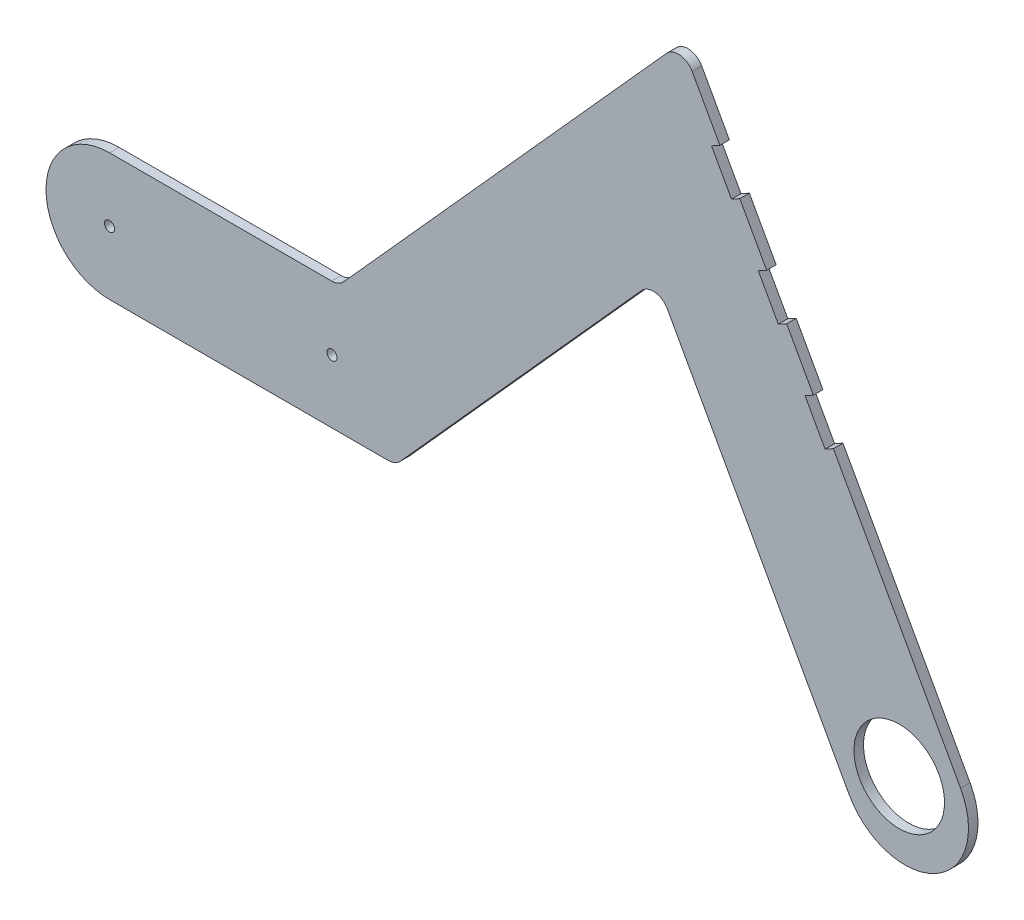
ISO-10303-21;
HEADER;
FILE_DESCRIPTION(('STEP AP214'),'2;1');
FILE_NAME('part.step','',(''),(''),'','','');
FILE_SCHEMA(('AUTOMOTIVE_DESIGN { 1 0 10303 214 1 1 1 1 }'));
ENDSEC;
DATA;
#1=APPLICATION_CONTEXT('core data for automotive mechanical design processes');
#2=APPLICATION_PROTOCOL_DEFINITION('international standard','automotive_design',2000,#1);
#3=PRODUCT_CONTEXT('',#1,'mechanical');
#4=PRODUCT('Part','Part','',(#3));
#5=PRODUCT_RELATED_PRODUCT_CATEGORY('part','',(#4));
#6=PRODUCT_DEFINITION_FORMATION('','',#4);
#7=PRODUCT_DEFINITION_CONTEXT('part definition',#1,'design');
#8=PRODUCT_DEFINITION('design','',#6,#7);
#9=PRODUCT_DEFINITION_SHAPE('','',#8);
#10=(LENGTH_UNIT() NAMED_UNIT(*) SI_UNIT(.MILLI.,.METRE.));
#11=(NAMED_UNIT(*) PLANE_ANGLE_UNIT() SI_UNIT($,.RADIAN.));
#12=(NAMED_UNIT(*) SI_UNIT($,.STERADIAN.) SOLID_ANGLE_UNIT());
#13=UNCERTAINTY_MEASURE_WITH_UNIT(LENGTH_MEASURE(1.E-05),#10,'distance_accuracy_value','');
#14=(GEOMETRIC_REPRESENTATION_CONTEXT(3) GLOBAL_UNCERTAINTY_ASSIGNED_CONTEXT((#13)) GLOBAL_UNIT_ASSIGNED_CONTEXT((#10,
#11,#12)) REPRESENTATION_CONTEXT('',''));
#15=CARTESIAN_POINT('',(0.,0.,0.));
#16=DIRECTION('',(0.,0.,1.));
#17=DIRECTION('',(1.,0.,0.));
#18=AXIS2_PLACEMENT_3D('',#15,#16,#17);
#19=CARTESIAN_POINT('',(47.5853332188057,145.502393907556,3.));
#20=DIRECTION('',(-0.875653678217041,-0.482939577820007,0.));
#21=DIRECTION('',(0.482939577820007,-0.875653678217041,0.));
#22=AXIS2_PLACEMENT_3D('',#19,#20,#21);
#23=PLANE('',#22);
#24=DIRECTION('',(-0.482939577820007,0.875653678217041,0.));
#25=VECTOR('',#24,1.);
#26=CARTESIAN_POINT('',(47.5853332188057,145.502393907556,3.));
#27=LINE('',#26,#25);
#28=CARTESIAN_POINT('',(56.2782456195659,129.740627699649,3.));
#29=VERTEX_POINT('',#28);
#30=CARTESIAN_POINT('',(47.5853332188057,145.502393907556,3.));
#31=VERTEX_POINT('',#30);
#32=EDGE_CURVE('E365',#29,#31,#27,.T.);
#33=ORIENTED_EDGE('',*,*,#32,.F.);
#34=DIRECTION('',(0.,0.,1.));
#35=VECTOR('',#34,1.);
#36=CARTESIAN_POINT('',(56.2782456195659,129.740627699649,3.));
#37=LINE('',#36,#35);
#38=CARTESIAN_POINT('',(56.2782456195659,129.740627699649,0.));
#39=VERTEX_POINT('',#38);
#40=EDGE_CURVE('E230',#39,#29,#37,.T.);
#41=ORIENTED_EDGE('',*,*,#40,.F.);
#42=DIRECTION('',(-0.482939577820007,0.875653678217041,0.));
#43=VECTOR('',#42,1.);
#44=CARTESIAN_POINT('',(47.5853332188057,145.502393907556,0.));
#45=LINE('',#44,#43);
#46=CARTESIAN_POINT('',(47.5853332188057,145.502393907556,0.));
#47=VERTEX_POINT('',#46);
#48=EDGE_CURVE('E405',#39,#47,#45,.T.);
#49=ORIENTED_EDGE('',*,*,#48,.T.);
#50=DIRECTION('',(0.,0.,-1.));
#51=VECTOR('',#50,1.);
#52=CARTESIAN_POINT('',(47.5853332188057,145.502393907556,3.));
#53=LINE('',#52,#51);
#54=EDGE_CURVE('E437',#31,#47,#53,.T.);
#55=ORIENTED_EDGE('',*,*,#54,.F.);
#56=EDGE_LOOP('',(#33,#41,#49,#55));
#57=FACE_BOUND('',#56,.T.);
#58=ADVANCED_FACE('F51',(#57),#23,.F.);
#59=CARTESIAN_POINT('',(70.9962652568578,103.054291306096,0.));
#60=VERTEX_POINT('',#59);
#61=CARTESIAN_POINT('',(62.5576471519857,118.354977607176,0.));
#62=VERTEX_POINT('',#61);
#63=EDGE_CURVE('E517',#60,#62,#45,.T.);
#64=ORIENTED_EDGE('',*,*,#63,.T.);
#65=DIRECTION('',(0.,0.,-1.));
#66=VECTOR('',#65,1.);
#67=CARTESIAN_POINT('',(62.5576471519857,118.354977607176,3.));
#68=LINE('',#67,#66);
#69=CARTESIAN_POINT('',(62.5576471519857,118.354977607176,3.));
#70=VERTEX_POINT('',#69);
#71=EDGE_CURVE('E268',#70,#62,#68,.T.);
#72=ORIENTED_EDGE('',*,*,#71,.F.);
#73=CARTESIAN_POINT('',(70.9962652568578,103.054291306096,3.));
#74=VERTEX_POINT('',#73);
#75=EDGE_CURVE('E237',#74,#70,#27,.T.);
#76=ORIENTED_EDGE('',*,*,#75,.F.);
#77=DIRECTION('',(0.,0.,1.));
#78=VECTOR('',#77,1.);
#79=CARTESIAN_POINT('',(70.9962652568578,103.054291306096,3.));
#80=LINE('',#79,#78);
#81=EDGE_CURVE('E261',#60,#74,#80,.T.);
#82=ORIENTED_EDGE('',*,*,#81,.F.);
#83=EDGE_LOOP('',(#64,#72,#76,#82));
#84=FACE_BOUND('',#83,.T.);
#85=ADVANCED_FACE('F565',(#84),#23,.F.);
#86=CARTESIAN_POINT('',(85.7142848941497,76.3679549125424,0.));
#87=VERTEX_POINT('',#86);
#88=CARTESIAN_POINT('',(77.2977547409545,91.628591905141,0.));
#89=VERTEX_POINT('',#88);
#90=EDGE_CURVE('E411',#87,#89,#45,.T.);
#91=ORIENTED_EDGE('',*,*,#90,.T.);
#92=DIRECTION('',(0.,0.,-1.));
#93=VECTOR('',#92,1.);
#94=CARTESIAN_POINT('',(77.2977547409545,91.628591905141,3.));
#95=LINE('',#94,#93);
#96=CARTESIAN_POINT('',(77.2977547409545,91.628591905141,3.));
#97=VERTEX_POINT('',#96);
#98=EDGE_CURVE('E264',#97,#89,#95,.T.);
#99=ORIENTED_EDGE('',*,*,#98,.F.);
#100=CARTESIAN_POINT('',(85.7142848941497,76.3679549125424,3.));
#101=VERTEX_POINT('',#100);
#102=EDGE_CURVE('E371',#101,#97,#27,.T.);
#103=ORIENTED_EDGE('',*,*,#102,.F.);
#104=DIRECTION('',(0.,0.,1.));
#105=VECTOR('',#104,1.);
#106=CARTESIAN_POINT('',(85.7142848941497,76.3679549125424,3.));
#107=LINE('',#106,#105);
#108=EDGE_CURVE('E297',#87,#101,#107,.T.);
#109=ORIENTED_EDGE('',*,*,#108,.F.);
#110=EDGE_LOOP('',(#91,#99,#103,#109));
#111=FACE_BOUND('',#110,.T.);
#112=ADVANCED_FACE('F528',(#111),#23,.F.);
#113=CARTESIAN_POINT('',(-135.81117841602,11.660861845859,3.));
#114=DIRECTION('',(0.,0.,-1.));
#115=DIRECTION('',(-1.,0.,0.));
#116=AXIS2_PLACEMENT_3D('',#113,#114,#115);
#117=PLANE('',#116);
#118=DIRECTION('',(0.482939577820008,-0.875653678217041,0.));
#119=VECTOR('',#118,1.);
#120=CARTESIAN_POINT('',(53.6512845849147,128.291808966189,3.));
#121=LINE('',#120,#119);
#122=CARTESIAN_POINT('',(53.6512845849147,128.291808966189,3.));
#123=VERTEX_POINT('',#122);
#124=CARTESIAN_POINT('',(59.9306861173346,116.906158873716,3.));
#125=VERTEX_POINT('',#124);
#126=EDGE_CURVE('E220',#123,#125,#121,.T.);
#127=ORIENTED_EDGE('',*,*,#126,.F.);
#128=DIRECTION('',(0.875653678217041,0.482939577820007,0.));
#129=VECTOR('',#128,1.);
#130=CARTESIAN_POINT('',(53.6512845849147,128.291808966189,3.));
#131=LINE('',#130,#129);
#132=EDGE_CURVE('E325',#123,#29,#131,.T.);
#133=ORIENTED_EDGE('',*,*,#132,.T.);
#134=ORIENTED_EDGE('',*,*,#32,.T.);
#135=CARTESIAN_POINT('',(43.2070648277205,143.087696018456,3.));
#136=DIRECTION('',(0.,0.,1.));
#137=DIRECTION('',(1.,0.,0.));
#138=AXIS2_PLACEMENT_3D('',#135,#136,#137);
#139=CIRCLE('',#138,5.);
#140=CARTESIAN_POINT('',(39.4880208236448,146.429658270748,3.));
#141=VERTEX_POINT('',#140);
#142=EDGE_CURVE('E370',#31,#141,#139,.T.);
#143=ORIENTED_EDGE('',*,*,#142,.T.);
#144=DIRECTION('',(-0.668392450458517,-0.743808800815141,0.));
#145=VECTOR('',#144,1.);
#146=CARTESIAN_POINT('',(-62.1541983630746,33.3188995935664,3.));
#147=LINE('',#146,#145);
#148=CARTESIAN_POINT('',(-62.1541983630746,33.3188995935664,3.));
#149=VERTEX_POINT('',#148);
#150=EDGE_CURVE('E374',#141,#149,#147,.T.);
#151=ORIENTED_EDGE('',*,*,#150,.T.);
#152=CARTESIAN_POINT('',(-65.8732423671503,36.660861845859,3.));
#153=DIRECTION('',(0.,0.,-1.));
#154=DIRECTION('',(-1.,0.,0.));
#155=AXIS2_PLACEMENT_3D('',#152,#153,#154);
#156=CIRCLE('',#155,5.);
#157=CARTESIAN_POINT('',(-65.8732423671503,31.660861845859,3.));
#158=VERTEX_POINT('',#157);
#159=EDGE_CURVE('E377',#149,#158,#156,.T.);
#160=ORIENTED_EDGE('',*,*,#159,.T.);
#161=DIRECTION('',(-1.,0.,0.));
#162=VECTOR('',#161,1.);
#163=CARTESIAN_POINT('',(-135.81117841602,31.660861845859,3.));
#164=LINE('',#163,#162);
#165=CARTESIAN_POINT('',(-135.81117841602,31.660861845859,3.));
#166=VERTEX_POINT('',#165);
#167=EDGE_CURVE('E380',#158,#166,#164,.T.);
#168=ORIENTED_EDGE('',*,*,#167,.T.);
#169=CARTESIAN_POINT('',(-135.81117841602,11.660861845859,3.));
#170=DIRECTION('',(0.,0.,1.));
#171=DIRECTION('',(-1.,0.,0.));
#172=AXIS2_PLACEMENT_3D('',#169,#170,#171);
#173=CIRCLE('',#172,20.);
#174=CARTESIAN_POINT('',(-135.81117841602,-8.33913815414105,3.));
#175=VERTEX_POINT('',#174);
#176=EDGE_CURVE('E342',#166,#175,#173,.T.);
#177=ORIENTED_EDGE('',*,*,#176,.T.);
#178=DIRECTION('',(1.,0.,0.));
#179=VECTOR('',#178,1.);
#180=CARTESIAN_POINT('',(-48.0402966328124,-8.33913815414104,3.));
#181=LINE('',#180,#179);
#182=CARTESIAN_POINT('',(-48.0402966328124,-8.33913815414104,3.));
#183=VERTEX_POINT('',#182);
#184=EDGE_CURVE('E346',#175,#183,#181,.T.);
#185=ORIENTED_EDGE('',*,*,#184,.T.);
#186=CARTESIAN_POINT('',(-48.0402966328124,-3.33913815414104,3.));
#187=DIRECTION('',(0.,0.,1.));
#188=DIRECTION('',(-1.,0.,0.));
#189=AXIS2_PLACEMENT_3D('',#186,#187,#188);
#190=CIRCLE('',#189,5.);
#191=CARTESIAN_POINT('',(-44.3212526287367,-6.68110040643362,3.));
#192=VERTEX_POINT('',#191);
#193=EDGE_CURVE('E350',#183,#192,#190,.T.);
#194=ORIENTED_EDGE('',*,*,#193,.T.);
#195=DIRECTION('',(0.668392450458517,0.743808800815141,0.));
#196=VECTOR('',#195,1.);
#197=CARTESIAN_POINT('',(31.6339667735705,77.8443316515208,3.));
#198=LINE('',#197,#196);
#199=CARTESIAN_POINT('',(31.6339667735705,77.8443316515208,3.));
#200=VERTEX_POINT('',#199);
#201=EDGE_CURVE('E353',#192,#200,#198,.T.);
#202=ORIENTED_EDGE('',*,*,#201,.T.);
#203=CARTESIAN_POINT('',(35.3530107776462,74.5023693992282,3.));
#204=DIRECTION('',(0.,0.,-1.));
#205=DIRECTION('',(1.,0.,0.));
#206=AXIS2_PLACEMENT_3D('',#203,#204,#205);
#207=CIRCLE('',#206,5.);
#208=CARTESIAN_POINT('',(39.7312791687314,76.9170672883282,3.));
#209=VERTEX_POINT('',#208);
#210=EDGE_CURVE('E356',#200,#209,#207,.T.);
#211=ORIENTED_EDGE('',*,*,#210,.T.);
#212=DIRECTION('',(0.482939577820007,-0.875653678217041,0.));
#213=VECTOR('',#212,1.);
#214=CARTESIAN_POINT('',(97.0169564632389,-26.9518561462004,3.));
#215=LINE('',#214,#213);
#216=CARTESIAN_POINT('',(97.0169564632389,-26.9518561462004,3.));
#217=VERTEX_POINT('',#216);
#218=EDGE_CURVE('E359',#209,#217,#215,.T.);
#219=ORIENTED_EDGE('',*,*,#218,.T.);
#220=CARTESIAN_POINT('',(114.53003002758,-17.2930645898003,3.));
#221=DIRECTION('',(0.,0.,1.));
#222=DIRECTION('',(-1.,0.,0.));
#223=AXIS2_PLACEMENT_3D('',#220,#221,#222);
#224=CIRCLE('',#223,20.);
#225=CARTESIAN_POINT('',(132.04310359192,-7.63427303340007,3.));
#226=VERTEX_POINT('',#225);
#227=EDGE_CURVE('E362',#217,#226,#224,.T.);
#228=ORIENTED_EDGE('',*,*,#227,.T.);
#229=CARTESIAN_POINT('',(92.0157743782464,64.9422555115878,3.));
#230=VERTEX_POINT('',#229);
#231=EDGE_CURVE('E366',#226,#230,#27,.T.);
#232=ORIENTED_EDGE('',*,*,#231,.T.);
#233=DIRECTION('',(0.875653678217041,0.482939577820007,0.));
#234=VECTOR('',#233,1.);
#235=CARTESIAN_POINT('',(89.3888133435953,63.4934367781278,3.));
#236=LINE('',#235,#234);
#237=CARTESIAN_POINT('',(89.3888133435953,63.4934367781278,3.));
#238=VERTEX_POINT('',#237);
#239=EDGE_CURVE('E282',#238,#230,#236,.T.);
#240=ORIENTED_EDGE('',*,*,#239,.F.);
#241=DIRECTION('',(0.482939577820007,-0.875653678217041,0.));
#242=VECTOR('',#241,1.);
#243=CARTESIAN_POINT('',(83.0873238594985,74.9191361790824,3.));
#244=LINE('',#243,#242);
#245=CARTESIAN_POINT('',(83.0873238594985,74.9191361790824,3.));
#246=VERTEX_POINT('',#245);
#247=EDGE_CURVE('E300',#246,#238,#244,.T.);
#248=ORIENTED_EDGE('',*,*,#247,.F.);
#249=DIRECTION('',(0.875653678217041,0.482939577820007,0.));
#250=VECTOR('',#249,1.);
#251=CARTESIAN_POINT('',(83.0873238594985,74.9191361790824,3.));
#252=LINE('',#251,#250);
#253=EDGE_CURVE('E293',#246,#101,#252,.T.);
#254=ORIENTED_EDGE('',*,*,#253,.T.);
#255=ORIENTED_EDGE('',*,*,#102,.T.);
#256=DIRECTION('',(0.875653678217041,0.482939577820007,0.));
#257=VECTOR('',#256,1.);
#258=CARTESIAN_POINT('',(74.6707937063034,90.179773171681,3.));
#259=LINE('',#258,#257);
#260=CARTESIAN_POINT('',(74.6707937063034,90.179773171681,3.));
#261=VERTEX_POINT('',#260);
#262=EDGE_CURVE('E75',#261,#97,#259,.T.);
#263=ORIENTED_EDGE('',*,*,#262,.F.);
#264=DIRECTION('',(0.482939577820007,-0.875653678217041,0.));
#265=VECTOR('',#264,1.);
#266=CARTESIAN_POINT('',(68.3693042222067,101.605472572636,3.));
#267=LINE('',#266,#265);
#268=CARTESIAN_POINT('',(68.3693042222067,101.605472572636,3.));
#269=VERTEX_POINT('',#268);
#270=EDGE_CURVE('E265',#269,#261,#267,.T.);
#271=ORIENTED_EDGE('',*,*,#270,.F.);
#272=DIRECTION('',(0.875653678217041,0.482939577820007,0.));
#273=VECTOR('',#272,1.);
#274=CARTESIAN_POINT('',(68.3693042222067,101.605472572636,3.));
#275=LINE('',#274,#273);
#276=EDGE_CURVE('E257',#269,#74,#275,.T.);
#277=ORIENTED_EDGE('',*,*,#276,.T.);
#278=ORIENTED_EDGE('',*,*,#75,.T.);
#279=DIRECTION('',(0.875653678217041,0.482939577820007,0.));
#280=VECTOR('',#279,1.);
#281=CARTESIAN_POINT('',(59.9306861173346,116.906158873716,3.));
#282=LINE('',#281,#280);
#283=EDGE_CURVE('E67',#125,#70,#282,.T.);
#284=ORIENTED_EDGE('',*,*,#283,.F.);
#285=EDGE_LOOP('',(#127,#133,#134,#143,#151,#160,#168,#177,#185,#194,#202,#211,#219,#228,#232,
#240,#248,#254,#255,#263,#271,#277,#278,#284));
#286=FACE_BOUND('',#285,.T.);
#287=CARTESIAN_POINT('',(-135.81117841602,11.660861845859,3.));
#288=DIRECTION('',(0.,0.,1.));
#289=DIRECTION('',(1.,0.,0.));
#290=AXIS2_PLACEMENT_3D('',#287,#288,#289);
#291=CIRCLE('',#290,1.58);
#292=CARTESIAN_POINT('',(-134.23117841602,11.660861845859,3.));
#293=VERTEX_POINT('',#292);
#294=EDGE_CURVE('E334',#293,#293,#291,.T.);
#295=ORIENTED_EDGE('',*,*,#294,.F.);
#296=EDGE_LOOP('',(#295));
#297=FACE_BOUND('',#296,.T.);
#298=CARTESIAN_POINT('',(-65.8112157802054,11.5885363003127,3.));
#299=DIRECTION('',(0.,0.,1.));
#300=DIRECTION('',(1.,0.,0.));
#301=AXIS2_PLACEMENT_3D('',#298,#299,#300);
#302=CIRCLE('',#301,1.58);
#303=CARTESIAN_POINT('',(-64.2312157802054,11.5885363003127,3.));
#304=VERTEX_POINT('',#303);
#305=EDGE_CURVE('E326',#304,#304,#302,.T.);
#306=ORIENTED_EDGE('',*,*,#305,.F.);
#307=EDGE_LOOP('',(#306));
#308=FACE_BOUND('',#307,.T.);
#309=CARTESIAN_POINT('',(112.738617641013,-14.0449215144664,3.));
#310=DIRECTION('',(0.,0.,1.));
#311=DIRECTION('',(1.,0.,0.));
#312=AXIS2_PLACEMENT_3D('',#309,#310,#311);
#313=CIRCLE('',#312,14.25);
#314=CARTESIAN_POINT('',(126.988617641013,-14.0449215144664,3.));
#315=VERTEX_POINT('',#314);
#316=EDGE_CURVE('E316',#315,#315,#313,.T.);
#317=ORIENTED_EDGE('',*,*,#316,.F.);
#318=EDGE_LOOP('',(#317));
#319=FACE_BOUND('',#318,.T.);
#320=ADVANCED_FACE('F233',(#286,#297,#308,#319),#117,.F.);
#321=CARTESIAN_POINT('',(-135.81117841602,11.660861845859,0.));
#322=DIRECTION('',(0.,0.,-1.));
#323=DIRECTION('',(-1.,0.,0.));
#324=AXIS2_PLACEMENT_3D('',#321,#322,#323);
#325=PLANE('',#324);
#326=DIRECTION('',(0.875653678217041,0.482939577820007,0.));
#327=VECTOR('',#326,1.);
#328=CARTESIAN_POINT('',(53.6512845849147,128.291808966189,0.));
#329=LINE('',#328,#327);
#330=CARTESIAN_POINT('',(53.6512845849147,128.291808966189,0.));
#331=VERTEX_POINT('',#330);
#332=EDGE_CURVE('E242',#331,#39,#329,.T.);
#333=ORIENTED_EDGE('',*,*,#332,.F.);
#334=DIRECTION('',(-0.482939577820008,0.875653678217041,0.));
#335=VECTOR('',#334,1.);
#336=CARTESIAN_POINT('',(53.6512845849147,128.291808966189,0.));
#337=LINE('',#336,#335);
#338=CARTESIAN_POINT('',(59.9306861173346,116.906158873716,0.));
#339=VERTEX_POINT('',#338);
#340=EDGE_CURVE('E219',#339,#331,#337,.T.);
#341=ORIENTED_EDGE('',*,*,#340,.F.);
#342=DIRECTION('',(0.875653678217041,0.482939577820007,0.));
#343=VECTOR('',#342,1.);
#344=CARTESIAN_POINT('',(59.9306861173346,116.906158873716,0.));
#345=LINE('',#344,#343);
#346=EDGE_CURVE('E215',#339,#62,#345,.T.);
#347=ORIENTED_EDGE('',*,*,#346,.T.);
#348=ORIENTED_EDGE('',*,*,#63,.F.);
#349=DIRECTION('',(0.875653678217041,0.482939577820007,0.));
#350=VECTOR('',#349,1.);
#351=CARTESIAN_POINT('',(68.3693042222067,101.605472572636,0.));
#352=LINE('',#351,#350);
#353=CARTESIAN_POINT('',(68.3693042222067,101.605472572636,0.));
#354=VERTEX_POINT('',#353);
#355=EDGE_CURVE('E254',#354,#60,#352,.T.);
#356=ORIENTED_EDGE('',*,*,#355,.F.);
#357=DIRECTION('',(-0.482939577820007,0.875653678217041,0.));
#358=VECTOR('',#357,1.);
#359=CARTESIAN_POINT('',(68.3693042222067,101.605472572636,0.));
#360=LINE('',#359,#358);
#361=CARTESIAN_POINT('',(74.6707937063034,90.179773171681,0.));
#362=VERTEX_POINT('',#361);
#363=EDGE_CURVE('E272',#362,#354,#360,.T.);
#364=ORIENTED_EDGE('',*,*,#363,.F.);
#365=DIRECTION('',(0.875653678217041,0.482939577820007,0.));
#366=VECTOR('',#365,1.);
#367=CARTESIAN_POINT('',(74.6707937063034,90.179773171681,0.));
#368=LINE('',#367,#366);
#369=EDGE_CURVE('E250',#362,#89,#368,.T.);
#370=ORIENTED_EDGE('',*,*,#369,.T.);
#371=ORIENTED_EDGE('',*,*,#90,.F.);
#372=DIRECTION('',(0.875653678217041,0.482939577820007,0.));
#373=VECTOR('',#372,1.);
#374=CARTESIAN_POINT('',(83.0873238594985,74.9191361790824,0.));
#375=LINE('',#374,#373);
#376=CARTESIAN_POINT('',(83.0873238594985,74.9191361790824,0.));
#377=VERTEX_POINT('',#376);
#378=EDGE_CURVE('E290',#377,#87,#375,.T.);
#379=ORIENTED_EDGE('',*,*,#378,.F.);
#380=DIRECTION('',(-0.482939577820007,0.875653678217041,0.));
#381=VECTOR('',#380,1.);
#382=CARTESIAN_POINT('',(83.0873238594985,74.9191361790824,0.));
#383=LINE('',#382,#381);
#384=CARTESIAN_POINT('',(89.3888133435953,63.4934367781278,0.));
#385=VERTEX_POINT('',#384);
#386=EDGE_CURVE('E306',#385,#377,#383,.T.);
#387=ORIENTED_EDGE('',*,*,#386,.F.);
#388=DIRECTION('',(0.875653678217041,0.482939577820007,0.));
#389=VECTOR('',#388,1.);
#390=CARTESIAN_POINT('',(89.3888133435953,63.4934367781278,0.));
#391=LINE('',#390,#389);
#392=CARTESIAN_POINT('',(92.0157743782464,64.9422555115878,0.));
#393=VERTEX_POINT('',#392);
#394=EDGE_CURVE('E286',#385,#393,#391,.T.);
#395=ORIENTED_EDGE('',*,*,#394,.T.);
#396=CARTESIAN_POINT('',(132.04310359192,-7.63427303340007,0.));
#397=VERTEX_POINT('',#396);
#398=EDGE_CURVE('E406',#397,#393,#45,.T.);
#399=ORIENTED_EDGE('',*,*,#398,.F.);
#400=CARTESIAN_POINT('',(114.53003002758,-17.2930645898003,0.));
#401=DIRECTION('',(0.,0.,1.));
#402=DIRECTION('',(-1.,0.,0.));
#403=AXIS2_PLACEMENT_3D('',#400,#401,#402);
#404=CIRCLE('',#403,20.);
#405=CARTESIAN_POINT('',(97.0169564632389,-26.9518561462004,0.));
#406=VERTEX_POINT('',#405);
#407=EDGE_CURVE('E402',#406,#397,#404,.T.);
#408=ORIENTED_EDGE('',*,*,#407,.F.);
#409=DIRECTION('',(0.482939577820007,-0.875653678217041,0.));
#410=VECTOR('',#409,1.);
#411=CARTESIAN_POINT('',(97.0169564632389,-26.9518561462004,0.));
#412=LINE('',#411,#410);
#413=CARTESIAN_POINT('',(39.7312791687314,76.9170672883282,0.));
#414=VERTEX_POINT('',#413);
#415=EDGE_CURVE('E399',#414,#406,#412,.T.);
#416=ORIENTED_EDGE('',*,*,#415,.F.);
#417=CARTESIAN_POINT('',(35.3530107776462,74.5023693992282,0.));
#418=DIRECTION('',(0.,0.,-1.));
#419=DIRECTION('',(1.,0.,0.));
#420=AXIS2_PLACEMENT_3D('',#417,#418,#419);
#421=CIRCLE('',#420,5.);
#422=CARTESIAN_POINT('',(31.6339667735705,77.8443316515208,0.));
#423=VERTEX_POINT('',#422);
#424=EDGE_CURVE('E396',#423,#414,#421,.T.);
#425=ORIENTED_EDGE('',*,*,#424,.F.);
#426=DIRECTION('',(0.668392450458517,0.743808800815141,0.));
#427=VECTOR('',#426,1.);
#428=CARTESIAN_POINT('',(31.6339667735705,77.8443316515208,0.));
#429=LINE('',#428,#427);
#430=CARTESIAN_POINT('',(-44.3212526287367,-6.68110040643362,0.));
#431=VERTEX_POINT('',#430);
#432=EDGE_CURVE('E393',#431,#423,#429,.T.);
#433=ORIENTED_EDGE('',*,*,#432,.F.);
#434=CARTESIAN_POINT('',(-48.0402966328124,-3.33913815414104,0.));
#435=DIRECTION('',(0.,0.,1.));
#436=DIRECTION('',(-1.,0.,0.));
#437=AXIS2_PLACEMENT_3D('',#434,#435,#436);
#438=CIRCLE('',#437,5.);
#439=CARTESIAN_POINT('',(-48.0402966328124,-8.33913815414104,0.));
#440=VERTEX_POINT('',#439);
#441=EDGE_CURVE('E390',#440,#431,#438,.T.);
#442=ORIENTED_EDGE('',*,*,#441,.F.);
#443=DIRECTION('',(1.,0.,0.));
#444=VECTOR('',#443,1.);
#445=CARTESIAN_POINT('',(-48.0402966328124,-8.33913815414104,0.));
#446=LINE('',#445,#444);
#447=CARTESIAN_POINT('',(-135.81117841602,-8.33913815414105,0.));
#448=VERTEX_POINT('',#447);
#449=EDGE_CURVE('E387',#448,#440,#446,.T.);
#450=ORIENTED_EDGE('',*,*,#449,.F.);
#451=CARTESIAN_POINT('',(-135.81117841602,11.660861845859,0.));
#452=DIRECTION('',(0.,0.,1.));
#453=DIRECTION('',(-1.,0.,0.));
#454=AXIS2_PLACEMENT_3D('',#451,#452,#453);
#455=CIRCLE('',#454,20.);
#456=CARTESIAN_POINT('',(-135.81117841602,31.660861845859,0.));
#457=VERTEX_POINT('',#456);
#458=EDGE_CURVE('E338',#457,#448,#455,.T.);
#459=ORIENTED_EDGE('',*,*,#458,.F.);
#460=DIRECTION('',(-1.,0.,0.));
#461=VECTOR('',#460,1.);
#462=CARTESIAN_POINT('',(-135.81117841602,31.660861845859,0.));
#463=LINE('',#462,#461);
#464=CARTESIAN_POINT('',(-65.8732423671503,31.660861845859,0.));
#465=VERTEX_POINT('',#464);
#466=EDGE_CURVE('E347',#465,#457,#463,.T.);
#467=ORIENTED_EDGE('',*,*,#466,.F.);
#468=CARTESIAN_POINT('',(-65.8732423671503,36.660861845859,0.));
#469=DIRECTION('',(0.,0.,-1.));
#470=DIRECTION('',(-1.,0.,0.));
#471=AXIS2_PLACEMENT_3D('',#468,#469,#470);
#472=CIRCLE('',#471,5.);
#473=CARTESIAN_POINT('',(-62.1541983630746,33.3188995935664,0.));
#474=VERTEX_POINT('',#473);
#475=EDGE_CURVE('E417',#474,#465,#472,.T.);
#476=ORIENTED_EDGE('',*,*,#475,.F.);
#477=DIRECTION('',(-0.668392450458517,-0.743808800815141,0.));
#478=VECTOR('',#477,1.);
#479=CARTESIAN_POINT('',(-62.1541983630746,33.3188995935664,0.));
#480=LINE('',#479,#478);
#481=CARTESIAN_POINT('',(39.4880208236448,146.429658270748,0.));
#482=VERTEX_POINT('',#481);
#483=EDGE_CURVE('E414',#482,#474,#480,.T.);
#484=ORIENTED_EDGE('',*,*,#483,.F.);
#485=CARTESIAN_POINT('',(43.2070648277205,143.087696018456,0.));
#486=DIRECTION('',(0.,0.,1.));
#487=DIRECTION('',(1.,0.,0.));
#488=AXIS2_PLACEMENT_3D('',#485,#486,#487);
#489=CIRCLE('',#488,5.);
#490=EDGE_CURVE('E410',#47,#482,#489,.T.);
#491=ORIENTED_EDGE('',*,*,#490,.F.);
#492=ORIENTED_EDGE('',*,*,#48,.F.);
#493=EDGE_LOOP('',(#333,#341,#347,#348,#356,#364,#370,#371,#379,#387,#395,#399,#408,#416,#425,
#433,#442,#450,#459,#467,#476,#484,#491,#492));
#494=FACE_BOUND('',#493,.T.);
#495=CARTESIAN_POINT('',(-65.8112157802054,11.5885363003127,0.));
#496=DIRECTION('',(0.,0.,1.));
#497=DIRECTION('',(1.,0.,0.));
#498=AXIS2_PLACEMENT_3D('',#495,#496,#497);
#499=CIRCLE('',#498,1.58);
#500=CARTESIAN_POINT('',(-64.2312157802054,11.5885363003127,0.));
#501=VERTEX_POINT('',#500);
#502=EDGE_CURVE('E320',#501,#501,#499,.T.);
#503=ORIENTED_EDGE('',*,*,#502,.T.);
#504=EDGE_LOOP('',(#503));
#505=FACE_BOUND('',#504,.T.);
#506=CARTESIAN_POINT('',(-135.81117841602,11.660861845859,0.));
#507=DIRECTION('',(0.,0.,1.));
#508=DIRECTION('',(1.,0.,0.));
#509=AXIS2_PLACEMENT_3D('',#506,#507,#508);
#510=CIRCLE('',#509,1.58);
#511=CARTESIAN_POINT('',(-134.23117841602,11.660861845859,0.));
#512=VERTEX_POINT('',#511);
#513=EDGE_CURVE('E330',#512,#512,#510,.T.);
#514=ORIENTED_EDGE('',*,*,#513,.T.);
#515=EDGE_LOOP('',(#514));
#516=FACE_BOUND('',#515,.T.);
#517=CARTESIAN_POINT('',(112.738617641013,-14.0449215144664,0.));
#518=DIRECTION('',(0.,0.,1.));
#519=DIRECTION('',(1.,0.,0.));
#520=AXIS2_PLACEMENT_3D('',#517,#518,#519);
#521=CIRCLE('',#520,14.25);
#522=CARTESIAN_POINT('',(126.988617641013,-14.0449215144664,0.));
#523=VERTEX_POINT('',#522);
#524=EDGE_CURVE('E321',#523,#523,#521,.T.);
#525=ORIENTED_EDGE('',*,*,#524,.T.);
#526=EDGE_LOOP('',(#525));
#527=FACE_BOUND('',#526,.T.);
#528=ADVANCED_FACE('F472',(#494,#505,#516,#527),#325,.T.);
#529=CARTESIAN_POINT('',(-135.81117841602,11.660861845859,3.));
#530=DIRECTION('',(0.,0.,-1.));
#531=DIRECTION('',(-1.,0.,0.));
#532=AXIS2_PLACEMENT_3D('',#529,#530,#531);
#533=CYLINDRICAL_SURFACE('',#532,20.);
#534=ORIENTED_EDGE('',*,*,#458,.T.);
#535=DIRECTION('',(0.,0.,-1.));
#536=VECTOR('',#535,1.);
#537=CARTESIAN_POINT('',(-135.81117841602,-8.33913815414105,3.));
#538=LINE('',#537,#536);
#539=EDGE_CURVE('E11',#175,#448,#538,.T.);
#540=ORIENTED_EDGE('',*,*,#539,.F.);
#541=ORIENTED_EDGE('',*,*,#176,.F.);
#542=DIRECTION('',(0.,0.,-1.));
#543=VECTOR('',#542,1.);
#544=CARTESIAN_POINT('',(-135.81117841602,31.660861845859,3.));
#545=LINE('',#544,#543);
#546=EDGE_CURVE('E383',#166,#457,#545,.T.);
#547=ORIENTED_EDGE('',*,*,#546,.T.);
#548=EDGE_LOOP('',(#534,#540,#541,#547));
#549=FACE_BOUND('',#548,.T.);
#550=ADVANCED_FACE('F53',(#549),#533,.T.);
#551=CARTESIAN_POINT('',(-48.0402966328124,-8.33913815414104,3.));
#552=DIRECTION('',(0.,1.,0.));
#553=DIRECTION('',(-1.,0.,0.));
#554=AXIS2_PLACEMENT_3D('',#551,#552,#553);
#555=PLANE('',#554);
#556=ORIENTED_EDGE('',*,*,#449,.T.);
#557=DIRECTION('',(0.,0.,-1.));
#558=VECTOR('',#557,1.);
#559=CARTESIAN_POINT('',(-48.0402966328124,-8.33913815414104,3.));
#560=LINE('',#559,#558);
#561=EDGE_CURVE('E60',#183,#440,#560,.T.);
#562=ORIENTED_EDGE('',*,*,#561,.F.);
#563=ORIENTED_EDGE('',*,*,#184,.F.);
#564=ORIENTED_EDGE('',*,*,#539,.T.);
#565=EDGE_LOOP('',(#556,#562,#563,#564));
#566=FACE_BOUND('',#565,.T.);
#567=ADVANCED_FACE('F489',(#566),#555,.F.);
#568=CARTESIAN_POINT('',(-48.0402966328124,-3.33913815414104,3.));
#569=DIRECTION('',(0.,0.,-1.));
#570=DIRECTION('',(-1.,0.,0.));
#571=AXIS2_PLACEMENT_3D('',#568,#569,#570);
#572=CYLINDRICAL_SURFACE('',#571,5.);
#573=ORIENTED_EDGE('',*,*,#441,.T.);
#574=DIRECTION('',(0.,0.,-1.));
#575=VECTOR('',#574,1.);
#576=CARTESIAN_POINT('',(-44.3212526287367,-6.68110040643362,3.));
#577=LINE('',#576,#575);
#578=EDGE_CURVE('E457',#192,#431,#577,.T.);
#579=ORIENTED_EDGE('',*,*,#578,.F.);
#580=ORIENTED_EDGE('',*,*,#193,.F.);
#581=ORIENTED_EDGE('',*,*,#561,.T.);
#582=EDGE_LOOP('',(#573,#579,#580,#581));
#583=FACE_BOUND('',#582,.T.);
#584=ADVANCED_FACE('F466',(#583),#572,.T.);
#585=CARTESIAN_POINT('',(31.6339667735705,77.8443316515208,3.));
#586=DIRECTION('',(-0.743808800815141,0.668392450458517,0.));
#587=DIRECTION('',(-0.668392450458517,-0.743808800815141,0.));
#588=AXIS2_PLACEMENT_3D('',#585,#586,#587);
#589=PLANE('',#588);
#590=ORIENTED_EDGE('',*,*,#432,.T.);
#591=DIRECTION('',(0.,0.,-1.));
#592=VECTOR('',#591,1.);
#593=CARTESIAN_POINT('',(31.6339667735705,77.8443316515208,3.));
#594=LINE('',#593,#592);
#595=EDGE_CURVE('E453',#200,#423,#594,.T.);
#596=ORIENTED_EDGE('',*,*,#595,.F.);
#597=ORIENTED_EDGE('',*,*,#201,.F.);
#598=ORIENTED_EDGE('',*,*,#578,.T.);
#599=EDGE_LOOP('',(#590,#596,#597,#598));
#600=FACE_BOUND('',#599,.T.);
#601=ADVANCED_FACE('F479',(#600),#589,.F.);
#602=CARTESIAN_POINT('',(35.3530107776462,74.5023693992282,3.));
#603=DIRECTION('',(0.,0.,-1.));
#604=DIRECTION('',(-1.,0.,0.));
#605=AXIS2_PLACEMENT_3D('',#602,#603,#604);
#606=CYLINDRICAL_SURFACE('',#605,5.);
#607=ORIENTED_EDGE('',*,*,#424,.T.);
#608=DIRECTION('',(0.,0.,-1.));
#609=VECTOR('',#608,1.);
#610=CARTESIAN_POINT('',(39.7312791687314,76.9170672883282,3.));
#611=LINE('',#610,#609);
#612=EDGE_CURVE('E449',#209,#414,#611,.T.);
#613=ORIENTED_EDGE('',*,*,#612,.F.);
#614=ORIENTED_EDGE('',*,*,#210,.F.);
#615=ORIENTED_EDGE('',*,*,#595,.T.);
#616=EDGE_LOOP('',(#607,#613,#614,#615));
#617=FACE_BOUND('',#616,.T.);
#618=ADVANCED_FACE('F483',(#617),#606,.F.);
#619=CARTESIAN_POINT('',(97.0169564632389,-26.9518561462004,3.));
#620=DIRECTION('',(0.875653678217041,0.482939577820007,0.));
#621=DIRECTION('',(-0.482939577820007,0.875653678217041,0.));
#622=AXIS2_PLACEMENT_3D('',#619,#620,#621);
#623=PLANE('',#622);
#624=ORIENTED_EDGE('',*,*,#415,.T.);
#625=DIRECTION('',(0.,0.,-1.));
#626=VECTOR('',#625,1.);
#627=CARTESIAN_POINT('',(97.0169564632389,-26.9518561462004,3.));
#628=LINE('',#627,#626);
#629=EDGE_CURVE('E445',#217,#406,#628,.T.);
#630=ORIENTED_EDGE('',*,*,#629,.F.);
#631=ORIENTED_EDGE('',*,*,#218,.F.);
#632=ORIENTED_EDGE('',*,*,#612,.T.);
#633=EDGE_LOOP('',(#624,#630,#631,#632));
#634=FACE_BOUND('',#633,.T.);
#635=ADVANCED_FACE('F580',(#634),#623,.F.);
#636=CARTESIAN_POINT('',(114.53003002758,-17.2930645898003,3.));
#637=DIRECTION('',(0.,0.,-1.));
#638=DIRECTION('',(-1.,0.,0.));
#639=AXIS2_PLACEMENT_3D('',#636,#637,#638);
#640=CYLINDRICAL_SURFACE('',#639,20.);
#641=ORIENTED_EDGE('',*,*,#407,.T.);
#642=DIRECTION('',(0.,0.,-1.));
#643=VECTOR('',#642,1.);
#644=CARTESIAN_POINT('',(132.04310359192,-7.63427303340007,3.));
#645=LINE('',#644,#643);
#646=EDGE_CURVE('E441',#226,#397,#645,.T.);
#647=ORIENTED_EDGE('',*,*,#646,.F.);
#648=ORIENTED_EDGE('',*,*,#227,.F.);
#649=ORIENTED_EDGE('',*,*,#629,.T.);
#650=EDGE_LOOP('',(#641,#647,#648,#649));
#651=FACE_BOUND('',#650,.T.);
#652=ADVANCED_FACE('F574',(#651),#640,.T.);
#653=ORIENTED_EDGE('',*,*,#398,.T.);
#654=DIRECTION('',(0.,0.,-1.));
#655=VECTOR('',#654,1.);
#656=CARTESIAN_POINT('',(92.0157743782464,64.9422555115878,3.));
#657=LINE('',#656,#655);
#658=EDGE_CURVE('E260',#230,#393,#657,.T.);
#659=ORIENTED_EDGE('',*,*,#658,.F.);
#660=ORIENTED_EDGE('',*,*,#231,.F.);
#661=ORIENTED_EDGE('',*,*,#646,.T.);
#662=EDGE_LOOP('',(#653,#659,#660,#661));
#663=FACE_BOUND('',#662,.T.);
#664=ADVANCED_FACE('F567',(#663),#23,.F.);
#665=CARTESIAN_POINT('',(43.2070648277205,143.087696018456,3.));
#666=DIRECTION('',(0.,0.,-1.));
#667=DIRECTION('',(-1.,0.,0.));
#668=AXIS2_PLACEMENT_3D('',#665,#666,#667);
#669=CYLINDRICAL_SURFACE('',#668,5.);
#670=ORIENTED_EDGE('',*,*,#490,.T.);
#671=DIRECTION('',(0.,0.,-1.));
#672=VECTOR('',#671,1.);
#673=CARTESIAN_POINT('',(39.4880208236448,146.429658270748,3.));
#674=LINE('',#673,#672);
#675=EDGE_CURVE('E433',#141,#482,#674,.T.);
#676=ORIENTED_EDGE('',*,*,#675,.F.);
#677=ORIENTED_EDGE('',*,*,#142,.F.);
#678=ORIENTED_EDGE('',*,*,#54,.T.);
#679=EDGE_LOOP('',(#670,#676,#677,#678));
#680=FACE_BOUND('',#679,.T.);
#681=ADVANCED_FACE('F510',(#680),#669,.T.);
#682=CARTESIAN_POINT('',(-62.1541983630746,33.3188995935664,3.));
#683=DIRECTION('',(0.743808800815141,-0.668392450458517,0.));
#684=DIRECTION('',(0.668392450458517,0.743808800815141,0.));
#685=AXIS2_PLACEMENT_3D('',#682,#683,#684);
#686=PLANE('',#685);
#687=ORIENTED_EDGE('',*,*,#483,.T.);
#688=DIRECTION('',(0.,0.,-1.));
#689=VECTOR('',#688,1.);
#690=CARTESIAN_POINT('',(-62.1541983630746,33.3188995935664,3.));
#691=LINE('',#690,#689);
#692=EDGE_CURVE('E429',#149,#474,#691,.T.);
#693=ORIENTED_EDGE('',*,*,#692,.F.);
#694=ORIENTED_EDGE('',*,*,#150,.F.);
#695=ORIENTED_EDGE('',*,*,#675,.T.);
#696=EDGE_LOOP('',(#687,#693,#694,#695));
#697=FACE_BOUND('',#696,.T.);
#698=ADVANCED_FACE('F505',(#697),#686,.F.);
#699=CARTESIAN_POINT('',(-65.8732423671503,36.660861845859,3.));
#700=DIRECTION('',(0.,0.,-1.));
#701=DIRECTION('',(-1.,0.,0.));
#702=AXIS2_PLACEMENT_3D('',#699,#700,#701);
#703=CYLINDRICAL_SURFACE('',#702,5.);
#704=ORIENTED_EDGE('',*,*,#475,.T.);
#705=DIRECTION('',(0.,0.,-1.));
#706=VECTOR('',#705,1.);
#707=CARTESIAN_POINT('',(-65.8732423671503,31.660861845859,3.));
#708=LINE('',#707,#706);
#709=EDGE_CURVE('E425',#158,#465,#708,.T.);
#710=ORIENTED_EDGE('',*,*,#709,.F.);
#711=ORIENTED_EDGE('',*,*,#159,.F.);
#712=ORIENTED_EDGE('',*,*,#692,.T.);
#713=EDGE_LOOP('',(#704,#710,#711,#712));
#714=FACE_BOUND('',#713,.T.);
#715=ADVANCED_FACE('F501',(#714),#703,.F.);
#716=CARTESIAN_POINT('',(-135.81117841602,31.660861845859,3.));
#717=DIRECTION('',(0.,-1.,0.));
#718=DIRECTION('',(0.,0.,-1.));
#719=AXIS2_PLACEMENT_3D('',#716,#717,#718);
#720=PLANE('',#719);
#721=ORIENTED_EDGE('',*,*,#466,.T.);
#722=ORIENTED_EDGE('',*,*,#546,.F.);
#723=ORIENTED_EDGE('',*,*,#167,.F.);
#724=ORIENTED_EDGE('',*,*,#709,.T.);
#725=EDGE_LOOP('',(#721,#722,#723,#724));
#726=FACE_BOUND('',#725,.T.);
#727=ADVANCED_FACE('F496',(#726),#720,.F.);
#728=CARTESIAN_POINT('',(-135.81117841602,11.660861845859,3.));
#729=DIRECTION('',(0.,0.,-1.));
#730=DIRECTION('',(-1.,0.,0.));
#731=AXIS2_PLACEMENT_3D('',#728,#729,#730);
#732=CYLINDRICAL_SURFACE('',#731,1.58);
#733=ORIENTED_EDGE('',*,*,#294,.T.);
#734=EDGE_LOOP('',(#733));
#735=FACE_BOUND('',#734,.T.);
#736=ORIENTED_EDGE('',*,*,#513,.F.);
#737=EDGE_LOOP('',(#736));
#738=FACE_BOUND('',#737,.T.);
#739=ADVANCED_FACE('F592',(#735,#738),#732,.F.);
#740=CARTESIAN_POINT('',(-65.8112157802054,11.5885363003127,3.));
#741=DIRECTION('',(0.,0.,-1.));
#742=DIRECTION('',(-1.,0.,0.));
#743=AXIS2_PLACEMENT_3D('',#740,#741,#742);
#744=CYLINDRICAL_SURFACE('',#743,1.58);
#745=ORIENTED_EDGE('',*,*,#305,.T.);
#746=EDGE_LOOP('',(#745));
#747=FACE_BOUND('',#746,.T.);
#748=ORIENTED_EDGE('',*,*,#502,.F.);
#749=EDGE_LOOP('',(#748));
#750=FACE_BOUND('',#749,.T.);
#751=ADVANCED_FACE('F618',(#747,#750),#744,.F.);
#752=CARTESIAN_POINT('',(112.738617641013,-14.0449215144664,3.));
#753=DIRECTION('',(0.,0.,-1.));
#754=DIRECTION('',(-1.,0.,0.));
#755=AXIS2_PLACEMENT_3D('',#752,#753,#754);
#756=CYLINDRICAL_SURFACE('',#755,14.25);
#757=ORIENTED_EDGE('',*,*,#316,.T.);
#758=EDGE_LOOP('',(#757));
#759=FACE_BOUND('',#758,.T.);
#760=ORIENTED_EDGE('',*,*,#524,.F.);
#761=EDGE_LOOP('',(#760));
#762=FACE_BOUND('',#761,.T.);
#763=ADVANCED_FACE('F625',(#759,#762),#756,.F.);
#764=CARTESIAN_POINT('',(83.0873238594985,74.9191361790824,3.));
#765=DIRECTION('',(-0.482939577820007,0.875653678217041,0.));
#766=DIRECTION('',(-0.875653678217041,-0.482939577820008,0.));
#767=AXIS2_PLACEMENT_3D('',#764,#765,#766);
#768=PLANE('',#767);
#769=ORIENTED_EDGE('',*,*,#108,.T.);
#770=ORIENTED_EDGE('',*,*,#253,.F.);
#771=DIRECTION('',(0.,0.,1.));
#772=VECTOR('',#771,1.);
#773=CARTESIAN_POINT('',(83.0873238594985,74.9191361790824,3.));
#774=LINE('',#773,#772);
#775=EDGE_CURVE('E285',#377,#246,#774,.T.);
#776=ORIENTED_EDGE('',*,*,#775,.F.);
#777=ORIENTED_EDGE('',*,*,#378,.T.);
#778=EDGE_LOOP('',(#769,#770,#776,#777));
#779=FACE_BOUND('',#778,.T.);
#780=ADVANCED_FACE('F632',(#779),#768,.F.);
#781=CARTESIAN_POINT('',(89.3888133435953,63.4934367781278,3.));
#782=DIRECTION('',(0.482939577820007,-0.875653678217041,0.));
#783=DIRECTION('',(0.875653678217041,0.482939577820008,0.));
#784=AXIS2_PLACEMENT_3D('',#781,#782,#783);
#785=PLANE('',#784);
#786=ORIENTED_EDGE('',*,*,#658,.T.);
#787=ORIENTED_EDGE('',*,*,#394,.F.);
#788=DIRECTION('',(0.,0.,-1.));
#789=VECTOR('',#788,1.);
#790=CARTESIAN_POINT('',(89.3888133435953,63.4934367781278,3.));
#791=LINE('',#790,#789);
#792=EDGE_CURVE('E309',#238,#385,#791,.T.);
#793=ORIENTED_EDGE('',*,*,#792,.F.);
#794=ORIENTED_EDGE('',*,*,#239,.T.);
#795=EDGE_LOOP('',(#786,#787,#793,#794));
#796=FACE_BOUND('',#795,.T.);
#797=ADVANCED_FACE('F640',(#796),#785,.F.);
#798=CARTESIAN_POINT('',(95.3912044875967,52.6100548298769,0.));
#799=DIRECTION('',(0.875653678217041,0.482939577820007,0.));
#800=DIRECTION('',(-0.482939577820007,0.875653678217041,0.));
#801=AXIS2_PLACEMENT_3D('',#798,#799,#800);
#802=PLANE('',#801);
#803=ORIENTED_EDGE('',*,*,#247,.T.);
#804=ORIENTED_EDGE('',*,*,#792,.T.);
#805=ORIENTED_EDGE('',*,*,#386,.T.);
#806=ORIENTED_EDGE('',*,*,#775,.T.);
#807=EDGE_LOOP('',(#803,#804,#805,#806));
#808=FACE_BOUND('',#807,.T.);
#809=ADVANCED_FACE('F648',(#808),#802,.T.);
#810=CARTESIAN_POINT('',(68.3693042222067,101.605472572636,3.));
#811=DIRECTION('',(-0.482939577820007,0.875653678217041,0.));
#812=DIRECTION('',(-0.875653678217041,-0.482939577820008,0.));
#813=AXIS2_PLACEMENT_3D('',#810,#811,#812);
#814=PLANE('',#813);
#815=ORIENTED_EDGE('',*,*,#81,.T.);
#816=ORIENTED_EDGE('',*,*,#276,.F.);
#817=DIRECTION('',(0.,0.,1.));
#818=VECTOR('',#817,1.);
#819=CARTESIAN_POINT('',(68.3693042222067,101.605472572636,3.));
#820=LINE('',#819,#818);
#821=EDGE_CURVE('E249',#354,#269,#820,.T.);
#822=ORIENTED_EDGE('',*,*,#821,.F.);
#823=ORIENTED_EDGE('',*,*,#355,.T.);
#824=EDGE_LOOP('',(#815,#816,#822,#823));
#825=FACE_BOUND('',#824,.T.);
#826=ADVANCED_FACE('F656',(#825),#814,.F.);
#827=CARTESIAN_POINT('',(74.6707937063034,90.179773171681,3.));
#828=DIRECTION('',(0.482939577820007,-0.875653678217041,0.));
#829=DIRECTION('',(0.875653678217041,0.482939577820008,0.));
#830=AXIS2_PLACEMENT_3D('',#827,#828,#829);
#831=PLANE('',#830);
#832=ORIENTED_EDGE('',*,*,#98,.T.);
#833=ORIENTED_EDGE('',*,*,#369,.F.);
#834=DIRECTION('',(0.,0.,-1.));
#835=VECTOR('',#834,1.);
#836=CARTESIAN_POINT('',(74.6707937063034,90.179773171681,3.));
#837=LINE('',#836,#835);
#838=EDGE_CURVE('E275',#261,#362,#837,.T.);
#839=ORIENTED_EDGE('',*,*,#838,.F.);
#840=ORIENTED_EDGE('',*,*,#262,.T.);
#841=EDGE_LOOP('',(#832,#833,#839,#840));
#842=FACE_BOUND('',#841,.T.);
#843=ADVANCED_FACE('F535',(#842),#831,.F.);
#844=CARTESIAN_POINT('',(95.3912044875967,52.6100548298769,0.));
#845=DIRECTION('',(0.875653678217041,0.482939577820007,0.));
#846=DIRECTION('',(-0.482939577820007,0.875653678217041,0.));
#847=AXIS2_PLACEMENT_3D('',#844,#845,#846);
#848=PLANE('',#847);
#849=ORIENTED_EDGE('',*,*,#270,.T.);
#850=ORIENTED_EDGE('',*,*,#838,.T.);
#851=ORIENTED_EDGE('',*,*,#363,.T.);
#852=ORIENTED_EDGE('',*,*,#821,.T.);
#853=EDGE_LOOP('',(#849,#850,#851,#852));
#854=FACE_BOUND('',#853,.T.);
#855=ADVANCED_FACE('F537',(#854),#848,.T.);
#856=CARTESIAN_POINT('',(53.6512845849147,128.291808966189,3.));
#857=DIRECTION('',(-0.482939577820007,0.875653678217041,0.));
#858=DIRECTION('',(-0.875653678217041,-0.482939577820008,0.));
#859=AXIS2_PLACEMENT_3D('',#856,#857,#858);
#860=PLANE('',#859);
#861=ORIENTED_EDGE('',*,*,#40,.T.);
#862=ORIENTED_EDGE('',*,*,#132,.F.);
#863=DIRECTION('',(0.,0.,1.));
#864=VECTOR('',#863,1.);
#865=CARTESIAN_POINT('',(53.6512845849147,128.291808966189,3.));
#866=LINE('',#865,#864);
#867=EDGE_CURVE('E226',#331,#123,#866,.T.);
#868=ORIENTED_EDGE('',*,*,#867,.F.);
#869=ORIENTED_EDGE('',*,*,#332,.T.);
#870=EDGE_LOOP('',(#861,#862,#868,#869));
#871=FACE_BOUND('',#870,.T.);
#872=ADVANCED_FACE('F554',(#871),#860,.F.);
#873=CARTESIAN_POINT('',(59.9306861173346,116.906158873716,3.));
#874=DIRECTION('',(0.482939577820007,-0.875653678217041,0.));
#875=DIRECTION('',(0.875653678217041,0.482939577820008,0.));
#876=AXIS2_PLACEMENT_3D('',#873,#874,#875);
#877=PLANE('',#876);
#878=ORIENTED_EDGE('',*,*,#71,.T.);
#879=ORIENTED_EDGE('',*,*,#346,.F.);
#880=DIRECTION('',(0.,0.,-1.));
#881=VECTOR('',#880,1.);
#882=CARTESIAN_POINT('',(59.9306861173346,116.906158873716,3.));
#883=LINE('',#882,#881);
#884=EDGE_CURVE('E211',#125,#339,#883,.T.);
#885=ORIENTED_EDGE('',*,*,#884,.F.);
#886=ORIENTED_EDGE('',*,*,#283,.T.);
#887=EDGE_LOOP('',(#878,#879,#885,#886));
#888=FACE_BOUND('',#887,.T.);
#889=ADVANCED_FACE('F213',(#888),#877,.F.);
#890=CARTESIAN_POINT('',(95.3912044875967,52.610054829877,0.));
#891=DIRECTION('',(0.875653678217041,0.482939577820008,0.));
#892=DIRECTION('',(-0.482939577820008,0.875653678217041,0.));
#893=AXIS2_PLACEMENT_3D('',#890,#891,#892);
#894=PLANE('',#893);
#895=ORIENTED_EDGE('',*,*,#126,.T.);
#896=ORIENTED_EDGE('',*,*,#884,.T.);
#897=ORIENTED_EDGE('',*,*,#340,.T.);
#898=ORIENTED_EDGE('',*,*,#867,.T.);
#899=EDGE_LOOP('',(#895,#896,#897,#898));
#900=FACE_BOUND('',#899,.T.);
#901=ADVANCED_FACE('F224',(#900),#894,.T.);
#902=CLOSED_SHELL('',(#58,#85,#112,#320,#528,#550,#567,#584,#601,#618,#635,#652,#664,#681,#698,
#715,#727,#739,#751,#763,#780,#797,#809,#826,#843,#855,#872,#889,#901));
#903=MANIFOLD_SOLID_BREP('B2',#902);
#904=ADVANCED_BREP_SHAPE_REPRESENTATION('',(#18,#903),#14);
#905=SHAPE_DEFINITION_REPRESENTATION(#9,#904);
ENDSEC;
END-ISO-10303-21;
